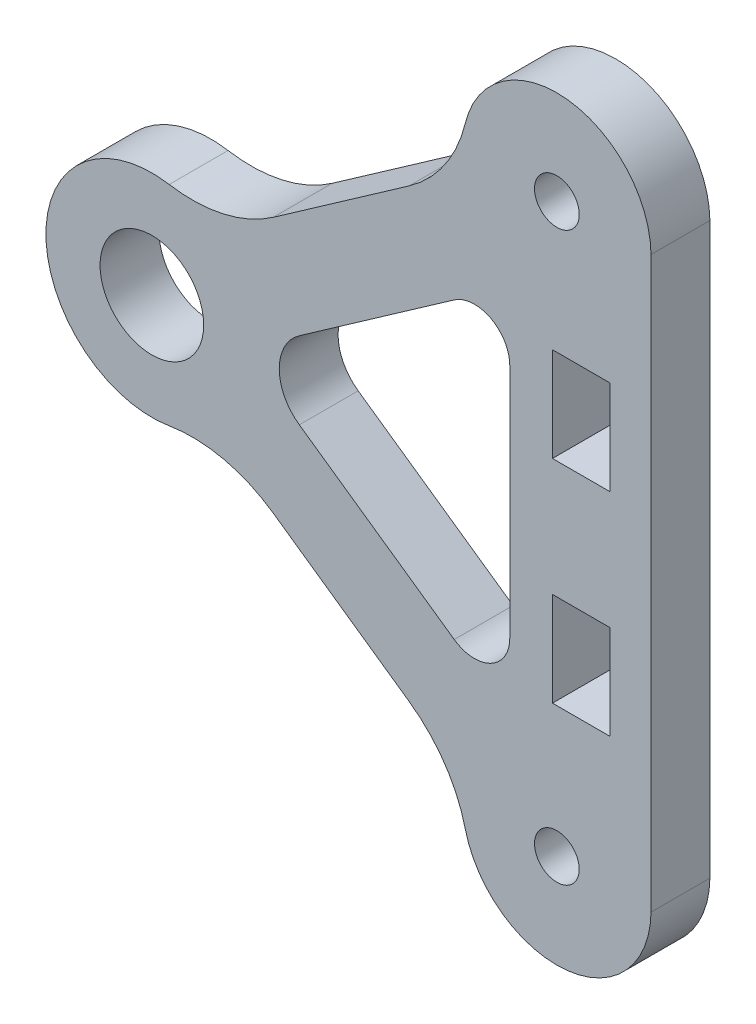
ISO-10303-21;
HEADER;
FILE_DESCRIPTION(('STEP AP214'),'2;1');
FILE_NAME('part.step','',(''),(''),'','','');
FILE_SCHEMA(('AUTOMOTIVE_DESIGN { 1 0 10303 214 1 1 1 1 }'));
ENDSEC;
DATA;
#1=APPLICATION_CONTEXT('core data for automotive mechanical design processes');
#2=APPLICATION_PROTOCOL_DEFINITION('international standard','automotive_design',2000,#1);
#3=PRODUCT_CONTEXT('',#1,'mechanical');
#4=PRODUCT('Part','Part','',(#3));
#5=PRODUCT_RELATED_PRODUCT_CATEGORY('part','',(#4));
#6=PRODUCT_DEFINITION_FORMATION('','',#4);
#7=PRODUCT_DEFINITION_CONTEXT('part definition',#1,'design');
#8=PRODUCT_DEFINITION('design','',#6,#7);
#9=PRODUCT_DEFINITION_SHAPE('','',#8);
#10=(LENGTH_UNIT() NAMED_UNIT(*) SI_UNIT(.MILLI.,.METRE.));
#11=(NAMED_UNIT(*) PLANE_ANGLE_UNIT() SI_UNIT($,.RADIAN.));
#12=(NAMED_UNIT(*) SI_UNIT($,.STERADIAN.) SOLID_ANGLE_UNIT());
#13=UNCERTAINTY_MEASURE_WITH_UNIT(LENGTH_MEASURE(1.E-05),#10,'distance_accuracy_value','');
#14=(GEOMETRIC_REPRESENTATION_CONTEXT(3) GLOBAL_UNCERTAINTY_ASSIGNED_CONTEXT((#13)) GLOBAL_UNIT_ASSIGNED_CONTEXT((#10,
#11,#12)) REPRESENTATION_CONTEXT('',''));
#15=CARTESIAN_POINT('',(0.,0.,0.));
#16=DIRECTION('',(0.,0.,1.));
#17=DIRECTION('',(1.,0.,0.));
#18=AXIS2_PLACEMENT_3D('',#15,#16,#17);
#19=CARTESIAN_POINT('',(-1.73781661886663,28.7897882256831,5.));
#20=DIRECTION('',(0.,0.,1.));
#21=DIRECTION('',(1.,0.,0.));
#22=AXIS2_PLACEMENT_3D('',#19,#20,#21);
#23=PLANE('',#22);
#24=CARTESIAN_POINT('',(17.7021927400794,-24.0902103267437,5.));
#25=DIRECTION('',(0.,0.,1.));
#26=DIRECTION('',(1.,0.,0.));
#27=AXIS2_PLACEMENT_3D('',#24,#25,#26);
#28=CIRCLE('',#27,1.89999999999996);
#29=CARTESIAN_POINT('',(19.6021927400794,-24.0902103267437,5.));
#30=VERTEX_POINT('',#29);
#31=EDGE_CURVE('E267',#30,#30,#28,.T.);
#32=ORIENTED_EDGE('',*,*,#31,.F.);
#33=EDGE_LOOP('',(#32));
#34=FACE_BOUND('',#33,.T.);
#35=DIRECTION('',(0.,1.,0.));
#36=VECTOR('',#35,1.);
#37=CARTESIAN_POINT('',(13.7021925500894,10.0329481065273,5.));
#38=LINE('',#37,#36);
#39=CARTESIAN_POINT('',(13.7021925500894,-10.0329481065273,5.));
#40=VERTEX_POINT('',#39);
#41=CARTESIAN_POINT('',(13.7021925500894,10.0329481065273,5.));
#42=VERTEX_POINT('',#41);
#43=EDGE_CURVE('E281',#40,#42,#38,.T.);
#44=ORIENTED_EDGE('',*,*,#43,.F.);
#45=CARTESIAN_POINT('',(10.7021925500894,-10.0329477062977,5.));
#46=DIRECTION('',(0.,0.,1.));
#47=DIRECTION('',(1.,0.,0.));
#48=AXIS2_PLACEMENT_3D('',#45,#46,#47);
#49=CIRCLE('',#48,3.0000000000001);
#50=CARTESIAN_POINT('',(8.98146324002347,-12.4904038384557,5.));
#51=VERTEX_POINT('',#50);
#52=EDGE_CURVE('E279',#51,#40,#49,.T.);
#53=ORIENTED_EDGE('',*,*,#52,.F.);
#54=DIRECTION('',(0.819152048620843,-0.573576430164522,0.));
#55=VECTOR('',#54,1.);
#56=CARTESIAN_POINT('',(8.98146324002347,-12.4904038384557,5.));
#57=LINE('',#56,#55);
#58=CARTESIAN_POINT('',(-4.17720086729856,-3.27660818584264,5.));
#59=VERTEX_POINT('',#58);
#60=EDGE_CURVE('E291',#59,#51,#57,.T.);
#61=ORIENTED_EDGE('',*,*,#60,.F.);
#62=CARTESIAN_POINT('',(-1.88289513430023,0.,5.));
#63=DIRECTION('',(0.,0.,1.));
#64=DIRECTION('',(1.,0.,0.));
#65=AXIS2_PLACEMENT_3D('',#62,#63,#64);
#66=CIRCLE('',#65,3.99999999999999);
#67=CARTESIAN_POINT('',(-4.17720086729856,3.27660818584263,5.));
#68=VERTEX_POINT('',#67);
#69=EDGE_CURVE('E288',#68,#59,#66,.T.);
#70=ORIENTED_EDGE('',*,*,#69,.F.);
#71=DIRECTION('',(-0.819152048620843,-0.573576430164522,0.));
#72=VECTOR('',#71,1.);
#73=CARTESIAN_POINT('',(-4.17720086729856,3.27660818584263,5.));
#74=LINE('',#73,#72);
#75=CARTESIAN_POINT('',(8.98146324002347,12.4904038384557,5.));
#76=VERTEX_POINT('',#75);
#77=EDGE_CURVE('E286',#76,#68,#74,.T.);
#78=ORIENTED_EDGE('',*,*,#77,.F.);
#79=CARTESIAN_POINT('',(10.7021925500894,10.0329477062979,5.));
#80=DIRECTION('',(0.,0.,1.));
#81=DIRECTION('',(1.,0.,0.));
#82=AXIS2_PLACEMENT_3D('',#79,#80,#81);
#83=CIRCLE('',#82,3.);
#84=EDGE_CURVE('E284',#42,#76,#83,.T.);
#85=ORIENTED_EDGE('',*,*,#84,.F.);
#86=EDGE_LOOP('',(#44,#53,#61,#70,#78,#85));
#87=FACE_BOUND('',#86,.T.);
#88=CARTESIAN_POINT('',(-1.73781661886663,28.7897882256831,5.));
#89=DIRECTION('',(0.,0.,-1.));
#90=DIRECTION('',(1.,0.,0.));
#91=AXIS2_PLACEMENT_3D('',#88,#89,#90);
#92=CIRCLE('',#91,11.9999999815206);
#93=CARTESIAN_POINT('',(9.92618898751999,25.9700414884905,5.));
#94=VERTEX_POINT('',#93);
#95=CARTESIAN_POINT('',(5.14510061734541,18.9599636942148,5.));
#96=VERTEX_POINT('',#95);
#97=EDGE_CURVE('E324',#94,#96,#92,.T.);
#98=ORIENTED_EDGE('',*,*,#97,.T.);
#99=DIRECTION('',(-0.819152033399257,-0.573576451903199,0.));
#100=VECTOR('',#99,1.);
#101=CARTESIAN_POINT('',(-6.38389520204441,10.8872735872865,5.));
#102=LINE('',#101,#100);
#103=CARTESIAN_POINT('',(-6.38389520204441,10.8872735872865,5.));
#104=VERTEX_POINT('',#103);
#105=EDGE_CURVE('E327',#96,#104,#102,.T.);
#106=ORIENTED_EDGE('',*,*,#105,.T.);
#107=CARTESIAN_POINT('',(-13.2668122940058,20.7170982197602,5.));
#108=DIRECTION('',(0.,0.,-1.));
#109=DIRECTION('',(1.,0.,0.));
#110=AXIS2_PLACEMENT_3D('',#107,#108,#109);
#111=CIRCLE('',#110,12.0000000003429);
#112=CARTESIAN_POINT('',(-15.2298870516567,8.87875638046088,5.));
#113=VERTEX_POINT('',#112);
#114=EDGE_CURVE('E330',#104,#113,#111,.T.);
#115=ORIENTED_EDGE('',*,*,#114,.T.);
#116=CARTESIAN_POINT('',(-16.7021931200584,-2.22044604925031E-13,5.));
#117=DIRECTION('',(0.,0.,1.));
#118=DIRECTION('',(1.,0.,0.));
#119=AXIS2_PLACEMENT_3D('',#116,#117,#118);
#120=CIRCLE('',#119,9.0000000009144);
#121=CARTESIAN_POINT('',(-15.2298870517126,-8.87875638012302,5.));
#122=VERTEX_POINT('',#121);
#123=EDGE_CURVE('E332',#113,#122,#120,.T.);
#124=ORIENTED_EDGE('',*,*,#123,.T.);
#125=CARTESIAN_POINT('',(-13.2668122940054,-20.7170982197604,5.));
#126=DIRECTION('',(0.,0.,-1.));
#127=DIRECTION('',(1.,0.,0.));
#128=AXIS2_PLACEMENT_3D('',#125,#126,#127);
#129=CIRCLE('',#128,12.0000000003429);
#130=CARTESIAN_POINT('',(-6.38389520184777,-10.8872735870056,5.));
#131=VERTEX_POINT('',#130);
#132=EDGE_CURVE('E334',#122,#131,#129,.T.);
#133=ORIENTED_EDGE('',*,*,#132,.T.);
#134=DIRECTION('',(0.819152033399257,-0.573576451903199,0.));
#135=VECTOR('',#134,1.);
#136=CARTESIAN_POINT('',(5.14510061734541,-18.9599636942148,5.));
#137=LINE('',#136,#135);
#138=CARTESIAN_POINT('',(5.14510061734541,-18.9599636942148,5.));
#139=VERTEX_POINT('',#138);
#140=EDGE_CURVE('E336',#131,#139,#137,.T.);
#141=ORIENTED_EDGE('',*,*,#140,.T.);
#142=CARTESIAN_POINT('',(-1.73781673118567,-28.7897881470367,5.));
#143=DIRECTION('',(0.,0.,-1.));
#144=DIRECTION('',(1.,0.,0.));
#145=AXIS2_PLACEMENT_3D('',#142,#143,#144);
#146=CIRCLE('',#145,11.9999999996595);
#147=CARTESIAN_POINT('',(9.92618895223582,-25.9700414547008,5.));
#148=VERTEX_POINT('',#147);
#149=EDGE_CURVE('E338',#139,#148,#146,.T.);
#150=ORIENTED_EDGE('',*,*,#149,.T.);
#151=CARTESIAN_POINT('',(17.7021927400794,-24.0902103267437,5.));
#152=DIRECTION('',(0.,0.,1.));
#153=DIRECTION('',(1.,0.,0.));
#154=AXIS2_PLACEMENT_3D('',#151,#152,#153);
#155=CIRCLE('',#154,7.99999999948895);
#156=CARTESIAN_POINT('',(25.7015677395685,-24.1902083735915,5.));
#157=VERTEX_POINT('',#156);
#158=EDGE_CURVE('E340',#148,#157,#155,.T.);
#159=ORIENTED_EDGE('',*,*,#158,.T.);
#160=DIRECTION('',(0.,1.,0.));
#161=VECTOR('',#160,1.);
#162=CARTESIAN_POINT('',(25.7015677400795,24.1902083735992,5.));
#163=LINE('',#162,#161);
#164=CARTESIAN_POINT('',(25.7015677400795,24.1902083735992,5.));
#165=VERTEX_POINT('',#164);
#166=EDGE_CURVE('E342',#157,#165,#163,.T.);
#167=ORIENTED_EDGE('',*,*,#166,.T.);
#168=CARTESIAN_POINT('',(17.7021927400794,24.0902103267435,5.));
#169=DIRECTION('',(0.,0.,1.));
#170=DIRECTION('',(1.,0.,0.));
#171=AXIS2_PLACEMENT_3D('',#168,#169,#170);
#172=CIRCLE('',#171,7.99999997228086);
#173=EDGE_CURVE('E344',#165,#94,#172,.T.);
#174=ORIENTED_EDGE('',*,*,#173,.T.);
#175=EDGE_LOOP('',(#98,#106,#115,#124,#133,#141,#150,#159,#167,#174));
#176=FACE_BOUND('',#175,.T.);
#177=CARTESIAN_POINT('',(17.7021927400794,24.0902103267435,5.));
#178=DIRECTION('',(0.,0.,1.));
#179=DIRECTION('',(1.,0.,0.));
#180=AXIS2_PLACEMENT_3D('',#177,#178,#179);
#181=CIRCLE('',#180,1.89999999999996);
#182=CARTESIAN_POINT('',(19.6021927400794,24.0902103267435,5.));
#183=VERTEX_POINT('',#182);
#184=EDGE_CURVE('E273',#183,#183,#181,.T.);
#185=ORIENTED_EDGE('',*,*,#184,.F.);
#186=EDGE_LOOP('',(#185));
#187=FACE_BOUND('',#186,.T.);
#188=CARTESIAN_POINT('',(-16.7021931200584,-2.22044604925031E-13,5.));
#189=DIRECTION('',(0.,0.,1.));
#190=DIRECTION('',(1.,0.,0.));
#191=AXIS2_PLACEMENT_3D('',#188,#189,#190);
#192=CIRCLE('',#191,4.40000000000001);
#193=CARTESIAN_POINT('',(-12.3021931200584,-2.22044604925031E-13,5.));
#194=VERTEX_POINT('',#193);
#195=EDGE_CURVE('E261',#194,#194,#192,.T.);
#196=ORIENTED_EDGE('',*,*,#195,.F.);
#197=EDGE_LOOP('',(#196));
#198=FACE_BOUND('',#197,.T.);
#199=DIRECTION('',(-1.,0.,0.));
#200=VECTOR('',#199,1.);
#201=CARTESIAN_POINT('',(17.3271927258297,13.0000002682211,5.));
#202=LINE('',#201,#200);
#203=CARTESIAN_POINT('',(22.2271925463635,13.0000002682211,5.));
#204=VERTEX_POINT('',#203);
#205=CARTESIAN_POINT('',(17.3271927258297,13.0000002682211,5.));
#206=VERTEX_POINT('',#205);
#207=EDGE_CURVE('E232',#204,#206,#202,.T.);
#208=ORIENTED_EDGE('',*,*,#207,.F.);
#209=DIRECTION('',(0.,1.,0.));
#210=VECTOR('',#209,1.);
#211=CARTESIAN_POINT('',(22.2271925463635,13.0000002682211,5.));
#212=LINE('',#211,#210);
#213=CARTESIAN_POINT('',(22.2271925463635,4.99999988824151,5.));
#214=VERTEX_POINT('',#213);
#215=EDGE_CURVE('E230',#214,#204,#212,.T.);
#216=ORIENTED_EDGE('',*,*,#215,.F.);
#217=DIRECTION('',(1.,0.,0.));
#218=VECTOR('',#217,1.);
#219=CARTESIAN_POINT('',(22.2271925463635,4.99999988824151,5.));
#220=LINE('',#219,#218);
#221=CARTESIAN_POINT('',(17.3271927258295,4.99999988824151,5.));
#222=VERTEX_POINT('',#221);
#223=EDGE_CURVE('E238',#222,#214,#220,.T.);
#224=ORIENTED_EDGE('',*,*,#223,.F.);
#225=DIRECTION('',(0.,-1.,0.));
#226=VECTOR('',#225,1.);
#227=CARTESIAN_POINT('',(17.3271927258295,4.99999988824151,5.));
#228=LINE('',#227,#226);
#229=EDGE_CURVE('E235',#206,#222,#228,.T.);
#230=ORIENTED_EDGE('',*,*,#229,.F.);
#231=EDGE_LOOP('',(#208,#216,#224,#230));
#232=FACE_BOUND('',#231,.T.);
#233=DIRECTION('',(-1.,0.,0.));
#234=VECTOR('',#233,1.);
#235=CARTESIAN_POINT('',(17.3271927258295,-4.99999988824107,5.));
#236=LINE('',#235,#234);
#237=CARTESIAN_POINT('',(22.2271925463637,-4.99999988824129,5.));
#238=VERTEX_POINT('',#237);
#239=CARTESIAN_POINT('',(17.3271927258295,-4.99999988824107,5.));
#240=VERTEX_POINT('',#239);
#241=EDGE_CURVE('E202',#238,#240,#236,.T.);
#242=ORIENTED_EDGE('',*,*,#241,.F.);
#243=DIRECTION('',(0.,1.,0.));
#244=VECTOR('',#243,1.);
#245=CARTESIAN_POINT('',(22.2271925463637,-4.99999988824129,5.));
#246=LINE('',#245,#244);
#247=CARTESIAN_POINT('',(22.2271925463637,-13.0000002682207,5.));
#248=VERTEX_POINT('',#247);
#249=EDGE_CURVE('E194',#248,#238,#246,.T.);
#250=ORIENTED_EDGE('',*,*,#249,.F.);
#251=DIRECTION('',(1.,0.,0.));
#252=VECTOR('',#251,1.);
#253=CARTESIAN_POINT('',(22.2271925463637,-13.0000002682207,5.));
#254=LINE('',#253,#252);
#255=CARTESIAN_POINT('',(17.3271927258295,-13.0000002682209,5.));
#256=VERTEX_POINT('',#255);
#257=EDGE_CURVE('E216',#256,#248,#254,.T.);
#258=ORIENTED_EDGE('',*,*,#257,.F.);
#259=DIRECTION('',(0.,-1.,0.));
#260=VECTOR('',#259,1.);
#261=CARTESIAN_POINT('',(17.3271927258295,-13.0000002682209,5.));
#262=LINE('',#261,#260);
#263=EDGE_CURVE('E214',#240,#256,#262,.T.);
#264=ORIENTED_EDGE('',*,*,#263,.F.);
#265=EDGE_LOOP('',(#242,#250,#258,#264));
#266=FACE_BOUND('',#265,.T.);
#267=ADVANCED_FACE('F33',(#34,#87,#176,#187,#198,#232,#266),#23,.T.);
#268=CARTESIAN_POINT('',(-1.73781661886663,28.7897882256831,0.));
#269=DIRECTION('',(0.,0.,1.));
#270=DIRECTION('',(1.,0.,0.));
#271=AXIS2_PLACEMENT_3D('',#268,#269,#270);
#272=PLANE('',#271);
#273=DIRECTION('',(0.,1.,0.));
#274=VECTOR('',#273,1.);
#275=CARTESIAN_POINT('',(22.2271925463635,13.0000002682211,0.));
#276=LINE('',#275,#274);
#277=CARTESIAN_POINT('',(22.2271925463635,4.99999988824151,0.));
#278=VERTEX_POINT('',#277);
#279=CARTESIAN_POINT('',(22.2271925463635,13.0000002682211,0.));
#280=VERTEX_POINT('',#279);
#281=EDGE_CURVE('E210',#278,#280,#276,.T.);
#282=ORIENTED_EDGE('',*,*,#281,.T.);
#283=DIRECTION('',(-1.,0.,0.));
#284=VECTOR('',#283,1.);
#285=CARTESIAN_POINT('',(17.3271927258297,13.0000002682211,0.));
#286=LINE('',#285,#284);
#287=CARTESIAN_POINT('',(17.3271927258297,13.0000002682211,0.));
#288=VERTEX_POINT('',#287);
#289=EDGE_CURVE('E243',#280,#288,#286,.T.);
#290=ORIENTED_EDGE('',*,*,#289,.T.);
#291=DIRECTION('',(0.,-1.,0.));
#292=VECTOR('',#291,1.);
#293=CARTESIAN_POINT('',(17.3271927258295,4.99999988824151,0.));
#294=LINE('',#293,#292);
#295=CARTESIAN_POINT('',(17.3271927258295,4.99999988824151,0.));
#296=VERTEX_POINT('',#295);
#297=EDGE_CURVE('E246',#288,#296,#294,.T.);
#298=ORIENTED_EDGE('',*,*,#297,.T.);
#299=DIRECTION('',(1.,0.,0.));
#300=VECTOR('',#299,1.);
#301=CARTESIAN_POINT('',(22.2271925463635,4.99999988824151,0.));
#302=LINE('',#301,#300);
#303=EDGE_CURVE('E233',#296,#278,#302,.T.);
#304=ORIENTED_EDGE('',*,*,#303,.T.);
#305=EDGE_LOOP('',(#282,#290,#298,#304));
#306=FACE_BOUND('',#305,.T.);
#307=CARTESIAN_POINT('',(-1.73781661886663,28.7897882256831,0.));
#308=DIRECTION('',(0.,0.,-1.));
#309=DIRECTION('',(1.,0.,0.));
#310=AXIS2_PLACEMENT_3D('',#307,#308,#309);
#311=CIRCLE('',#310,11.9999999815206);
#312=CARTESIAN_POINT('',(9.92618898751999,25.9700414884905,0.));
#313=VERTEX_POINT('',#312);
#314=CARTESIAN_POINT('',(5.14510061734541,18.9599636942148,0.));
#315=VERTEX_POINT('',#314);
#316=EDGE_CURVE('E323',#313,#315,#311,.T.);
#317=ORIENTED_EDGE('',*,*,#316,.F.);
#318=CARTESIAN_POINT('',(17.7021927400794,24.0902103267435,0.));
#319=DIRECTION('',(0.,0.,1.));
#320=DIRECTION('',(1.,0.,0.));
#321=AXIS2_PLACEMENT_3D('',#318,#319,#320);
#322=CIRCLE('',#321,7.99999997228086);
#323=CARTESIAN_POINT('',(25.7015677400795,24.1902083735992,0.));
#324=VERTEX_POINT('',#323);
#325=EDGE_CURVE('E328',#324,#313,#322,.T.);
#326=ORIENTED_EDGE('',*,*,#325,.F.);
#327=DIRECTION('',(0.,1.,0.));
#328=VECTOR('',#327,1.);
#329=CARTESIAN_POINT('',(25.7015677400795,24.1902083735992,0.));
#330=LINE('',#329,#328);
#331=CARTESIAN_POINT('',(25.7015677395685,-24.1902083735915,0.));
#332=VERTEX_POINT('',#331);
#333=EDGE_CURVE('E363',#332,#324,#330,.T.);
#334=ORIENTED_EDGE('',*,*,#333,.F.);
#335=CARTESIAN_POINT('',(17.7021927400794,-24.0902103267437,0.));
#336=DIRECTION('',(0.,0.,1.));
#337=DIRECTION('',(1.,0.,0.));
#338=AXIS2_PLACEMENT_3D('',#335,#336,#337);
#339=CIRCLE('',#338,7.99999999948895);
#340=CARTESIAN_POINT('',(9.92618895223582,-25.9700414547008,0.));
#341=VERTEX_POINT('',#340);
#342=EDGE_CURVE('E361',#341,#332,#339,.T.);
#343=ORIENTED_EDGE('',*,*,#342,.F.);
#344=CARTESIAN_POINT('',(-1.73781673118567,-28.7897881470367,0.));
#345=DIRECTION('',(0.,0.,-1.));
#346=DIRECTION('',(1.,0.,0.));
#347=AXIS2_PLACEMENT_3D('',#344,#345,#346);
#348=CIRCLE('',#347,11.9999999996595);
#349=CARTESIAN_POINT('',(5.14510061734541,-18.9599636942148,0.));
#350=VERTEX_POINT('',#349);
#351=EDGE_CURVE('E359',#350,#341,#348,.T.);
#352=ORIENTED_EDGE('',*,*,#351,.F.);
#353=DIRECTION('',(0.819152033399257,-0.573576451903199,0.));
#354=VECTOR('',#353,1.);
#355=CARTESIAN_POINT('',(5.14510061734541,-18.9599636942148,0.));
#356=LINE('',#355,#354);
#357=CARTESIAN_POINT('',(-6.38389520184777,-10.8872735870056,0.));
#358=VERTEX_POINT('',#357);
#359=EDGE_CURVE('E357',#358,#350,#356,.T.);
#360=ORIENTED_EDGE('',*,*,#359,.F.);
#361=CARTESIAN_POINT('',(-13.2668122940054,-20.7170982197604,0.));
#362=DIRECTION('',(0.,0.,-1.));
#363=DIRECTION('',(1.,0.,0.));
#364=AXIS2_PLACEMENT_3D('',#361,#362,#363);
#365=CIRCLE('',#364,12.0000000003429);
#366=CARTESIAN_POINT('',(-15.2298870517126,-8.87875638012302,0.));
#367=VERTEX_POINT('',#366);
#368=EDGE_CURVE('E355',#367,#358,#365,.T.);
#369=ORIENTED_EDGE('',*,*,#368,.F.);
#370=CARTESIAN_POINT('',(-16.7021931200584,-2.22044604925031E-13,0.));
#371=DIRECTION('',(0.,0.,1.));
#372=DIRECTION('',(1.,0.,0.));
#373=AXIS2_PLACEMENT_3D('',#370,#371,#372);
#374=CIRCLE('',#373,9.0000000009144);
#375=CARTESIAN_POINT('',(-15.2298870516567,8.87875638046088,0.));
#376=VERTEX_POINT('',#375);
#377=EDGE_CURVE('E353',#376,#367,#374,.T.);
#378=ORIENTED_EDGE('',*,*,#377,.F.);
#379=CARTESIAN_POINT('',(-13.2668122940058,20.7170982197602,0.));
#380=DIRECTION('',(0.,0.,-1.));
#381=DIRECTION('',(1.,0.,0.));
#382=AXIS2_PLACEMENT_3D('',#379,#380,#381);
#383=CIRCLE('',#382,12.0000000003429);
#384=CARTESIAN_POINT('',(-6.38389520204441,10.8872735872865,0.));
#385=VERTEX_POINT('',#384);
#386=EDGE_CURVE('E351',#385,#376,#383,.T.);
#387=ORIENTED_EDGE('',*,*,#386,.F.);
#388=DIRECTION('',(-0.819152033399257,-0.573576451903199,0.));
#389=VECTOR('',#388,1.);
#390=CARTESIAN_POINT('',(-6.38389520204441,10.8872735872865,0.));
#391=LINE('',#390,#389);
#392=EDGE_CURVE('E349',#315,#385,#391,.T.);
#393=ORIENTED_EDGE('',*,*,#392,.F.);
#394=EDGE_LOOP('',(#317,#326,#334,#343,#352,#360,#369,#378,#387,#393));
#395=FACE_BOUND('',#394,.T.);
#396=CARTESIAN_POINT('',(10.7021925500894,-10.0329477062977,0.));
#397=DIRECTION('',(0.,0.,1.));
#398=DIRECTION('',(1.,0.,0.));
#399=AXIS2_PLACEMENT_3D('',#396,#397,#398);
#400=CIRCLE('',#399,3.0000000000001);
#401=CARTESIAN_POINT('',(8.98146324002347,-12.4904038384557,0.));
#402=VERTEX_POINT('',#401);
#403=CARTESIAN_POINT('',(13.7021925500894,-10.0329481065273,0.));
#404=VERTEX_POINT('',#403);
#405=EDGE_CURVE('E276',#402,#404,#400,.T.);
#406=ORIENTED_EDGE('',*,*,#405,.T.);
#407=DIRECTION('',(0.,1.,0.));
#408=VECTOR('',#407,1.);
#409=CARTESIAN_POINT('',(13.7021925500894,10.0329481065273,0.));
#410=LINE('',#409,#408);
#411=CARTESIAN_POINT('',(13.7021925500894,10.0329481065273,0.));
#412=VERTEX_POINT('',#411);
#413=EDGE_CURVE('E296',#404,#412,#410,.T.);
#414=ORIENTED_EDGE('',*,*,#413,.T.);
#415=CARTESIAN_POINT('',(10.7021925500894,10.0329477062979,0.));
#416=DIRECTION('',(0.,0.,1.));
#417=DIRECTION('',(1.,0.,0.));
#418=AXIS2_PLACEMENT_3D('',#415,#416,#417);
#419=CIRCLE('',#418,3.);
#420=CARTESIAN_POINT('',(8.98146324002347,12.4904038384557,0.));
#421=VERTEX_POINT('',#420);
#422=EDGE_CURVE('E299',#412,#421,#419,.T.);
#423=ORIENTED_EDGE('',*,*,#422,.T.);
#424=DIRECTION('',(-0.819152048620843,-0.573576430164522,0.));
#425=VECTOR('',#424,1.);
#426=CARTESIAN_POINT('',(-4.17720086729856,3.27660818584263,0.));
#427=LINE('',#426,#425);
#428=CARTESIAN_POINT('',(-4.17720086729856,3.27660818584263,0.));
#429=VERTEX_POINT('',#428);
#430=EDGE_CURVE('E302',#421,#429,#427,.T.);
#431=ORIENTED_EDGE('',*,*,#430,.T.);
#432=CARTESIAN_POINT('',(-1.88289513430023,0.,0.));
#433=DIRECTION('',(0.,0.,1.));
#434=DIRECTION('',(1.,0.,0.));
#435=AXIS2_PLACEMENT_3D('',#432,#433,#434);
#436=CIRCLE('',#435,3.99999999999999);
#437=CARTESIAN_POINT('',(-4.17720086729856,-3.27660818584263,0.));
#438=VERTEX_POINT('',#437);
#439=EDGE_CURVE('E305',#429,#438,#436,.T.);
#440=ORIENTED_EDGE('',*,*,#439,.T.);
#441=DIRECTION('',(0.819152048620843,-0.573576430164522,0.));
#442=VECTOR('',#441,1.);
#443=CARTESIAN_POINT('',(8.98146324002347,-12.4904038384557,0.));
#444=LINE('',#443,#442);
#445=EDGE_CURVE('E282',#438,#402,#444,.T.);
#446=ORIENTED_EDGE('',*,*,#445,.T.);
#447=EDGE_LOOP('',(#406,#414,#423,#431,#440,#446));
#448=FACE_BOUND('',#447,.T.);
#449=CARTESIAN_POINT('',(17.7021927400794,24.0902103267435,0.));
#450=DIRECTION('',(0.,0.,1.));
#451=DIRECTION('',(1.,0.,0.));
#452=AXIS2_PLACEMENT_3D('',#449,#450,#451);
#453=CIRCLE('',#452,1.89999999999996);
#454=CARTESIAN_POINT('',(19.6021927400794,24.0902103267435,0.));
#455=VERTEX_POINT('',#454);
#456=EDGE_CURVE('E270',#455,#455,#453,.T.);
#457=ORIENTED_EDGE('',*,*,#456,.T.);
#458=EDGE_LOOP('',(#457));
#459=FACE_BOUND('',#458,.T.);
#460=CARTESIAN_POINT('',(17.7021927400794,-24.0902103267437,0.));
#461=DIRECTION('',(0.,0.,1.));
#462=DIRECTION('',(1.,0.,0.));
#463=AXIS2_PLACEMENT_3D('',#460,#461,#462);
#464=CIRCLE('',#463,1.89999999999996);
#465=CARTESIAN_POINT('',(19.6021927400794,-24.0902103267437,0.));
#466=VERTEX_POINT('',#465);
#467=EDGE_CURVE('E264',#466,#466,#464,.T.);
#468=ORIENTED_EDGE('',*,*,#467,.T.);
#469=EDGE_LOOP('',(#468));
#470=FACE_BOUND('',#469,.T.);
#471=CARTESIAN_POINT('',(-16.7021931200584,-2.22044604925031E-13,0.));
#472=DIRECTION('',(0.,0.,1.));
#473=DIRECTION('',(1.,0.,0.));
#474=AXIS2_PLACEMENT_3D('',#471,#472,#473);
#475=CIRCLE('',#474,4.40000000000001);
#476=CARTESIAN_POINT('',(-12.3021931200584,-2.22044604925031E-13,0.));
#477=VERTEX_POINT('',#476);
#478=EDGE_CURVE('E260',#477,#477,#475,.T.);
#479=ORIENTED_EDGE('',*,*,#478,.T.);
#480=EDGE_LOOP('',(#479));
#481=FACE_BOUND('',#480,.T.);
#482=DIRECTION('',(0.,1.,0.));
#483=VECTOR('',#482,1.);
#484=CARTESIAN_POINT('',(22.2271925463637,-4.99999988824129,0.));
#485=LINE('',#484,#483);
#486=CARTESIAN_POINT('',(22.2271925463637,-13.0000002682207,0.));
#487=VERTEX_POINT('',#486);
#488=CARTESIAN_POINT('',(22.2271925463637,-4.99999988824129,0.));
#489=VERTEX_POINT('',#488);
#490=EDGE_CURVE('E56',#487,#489,#485,.T.);
#491=ORIENTED_EDGE('',*,*,#490,.T.);
#492=DIRECTION('',(-1.,0.,0.));
#493=VECTOR('',#492,1.);
#494=CARTESIAN_POINT('',(17.3271927258295,-4.99999988824107,0.));
#495=LINE('',#494,#493);
#496=CARTESIAN_POINT('',(17.3271927258295,-4.99999988824107,0.));
#497=VERTEX_POINT('',#496);
#498=EDGE_CURVE('E209',#489,#497,#495,.T.);
#499=ORIENTED_EDGE('',*,*,#498,.T.);
#500=DIRECTION('',(0.,-1.,0.));
#501=VECTOR('',#500,1.);
#502=CARTESIAN_POINT('',(17.3271927258295,-13.0000002682209,0.));
#503=LINE('',#502,#501);
#504=CARTESIAN_POINT('',(17.3271927258295,-13.0000002682209,0.));
#505=VERTEX_POINT('',#504);
#506=EDGE_CURVE('E222',#497,#505,#503,.T.);
#507=ORIENTED_EDGE('',*,*,#506,.T.);
#508=DIRECTION('',(1.,0.,0.));
#509=VECTOR('',#508,1.);
#510=CARTESIAN_POINT('',(22.2271925463637,-13.0000002682207,0.));
#511=LINE('',#510,#509);
#512=EDGE_CURVE('E203',#505,#487,#511,.T.);
#513=ORIENTED_EDGE('',*,*,#512,.T.);
#514=EDGE_LOOP('',(#491,#499,#507,#513));
#515=FACE_BOUND('',#514,.T.);
#516=ADVANCED_FACE('F399',(#306,#395,#448,#459,#470,#481,#515),#272,.F.);
#517=CARTESIAN_POINT('',(-1.73781661886663,28.7897882256831,5.));
#518=DIRECTION('',(0.,0.,-1.));
#519=DIRECTION('',(-1.,0.,0.));
#520=AXIS2_PLACEMENT_3D('',#517,#518,#519);
#521=CYLINDRICAL_SURFACE('',#520,11.9999999815206);
#522=ORIENTED_EDGE('',*,*,#316,.T.);
#523=DIRECTION('',(0.,0.,-1.));
#524=VECTOR('',#523,1.);
#525=CARTESIAN_POINT('',(5.14510061734541,18.9599636942148,5.));
#526=LINE('',#525,#524);
#527=EDGE_CURVE('E11',#96,#315,#526,.T.);
#528=ORIENTED_EDGE('',*,*,#527,.F.);
#529=ORIENTED_EDGE('',*,*,#97,.F.);
#530=DIRECTION('',(0.,0.,-1.));
#531=VECTOR('',#530,1.);
#532=CARTESIAN_POINT('',(9.92618898751999,25.9700414884905,5.));
#533=LINE('',#532,#531);
#534=EDGE_CURVE('E346',#94,#313,#533,.T.);
#535=ORIENTED_EDGE('',*,*,#534,.T.);
#536=EDGE_LOOP('',(#522,#528,#529,#535));
#537=FACE_BOUND('',#536,.T.);
#538=ADVANCED_FACE('F35',(#537),#521,.F.);
#539=CARTESIAN_POINT('',(-6.38389520204441,10.8872735872865,5.));
#540=DIRECTION('',(0.573576451903199,-0.819152033399257,0.));
#541=DIRECTION('',(0.819152033399257,0.573576451903199,0.));
#542=AXIS2_PLACEMENT_3D('',#539,#540,#541);
#543=PLANE('',#542);
#544=ORIENTED_EDGE('',*,*,#392,.T.);
#545=DIRECTION('',(0.,0.,-1.));
#546=VECTOR('',#545,1.);
#547=CARTESIAN_POINT('',(-6.38389520204441,10.8872735872865,5.));
#548=LINE('',#547,#546);
#549=EDGE_CURVE('E41',#104,#385,#548,.T.);
#550=ORIENTED_EDGE('',*,*,#549,.F.);
#551=ORIENTED_EDGE('',*,*,#105,.F.);
#552=ORIENTED_EDGE('',*,*,#527,.T.);
#553=EDGE_LOOP('',(#544,#550,#551,#552));
#554=FACE_BOUND('',#553,.T.);
#555=ADVANCED_FACE('F417',(#554),#543,.F.);
#556=CARTESIAN_POINT('',(-13.2668122940058,20.7170982197602,5.));
#557=DIRECTION('',(0.,0.,-1.));
#558=DIRECTION('',(-1.,0.,0.));
#559=AXIS2_PLACEMENT_3D('',#556,#557,#558);
#560=CYLINDRICAL_SURFACE('',#559,12.0000000003429);
#561=ORIENTED_EDGE('',*,*,#386,.T.);
#562=DIRECTION('',(0.,0.,-1.));
#563=VECTOR('',#562,1.);
#564=CARTESIAN_POINT('',(-15.2298870516567,8.87875638046088,5.));
#565=LINE('',#564,#563);
#566=EDGE_CURVE('E386',#113,#376,#565,.T.);
#567=ORIENTED_EDGE('',*,*,#566,.F.);
#568=ORIENTED_EDGE('',*,*,#114,.F.);
#569=ORIENTED_EDGE('',*,*,#549,.T.);
#570=EDGE_LOOP('',(#561,#567,#568,#569));
#571=FACE_BOUND('',#570,.T.);
#572=ADVANCED_FACE('F393',(#571),#560,.F.);
#573=CARTESIAN_POINT('',(-16.7021931200584,-2.22044604925031E-13,5.));
#574=DIRECTION('',(0.,0.,-1.));
#575=DIRECTION('',(-1.,0.,0.));
#576=AXIS2_PLACEMENT_3D('',#573,#574,#575);
#577=CYLINDRICAL_SURFACE('',#576,9.0000000009144);
#578=ORIENTED_EDGE('',*,*,#377,.T.);
#579=DIRECTION('',(0.,0.,-1.));
#580=VECTOR('',#579,1.);
#581=CARTESIAN_POINT('',(-15.2298870517126,-8.87875638012302,5.));
#582=LINE('',#581,#580);
#583=EDGE_CURVE('E383',#122,#367,#582,.T.);
#584=ORIENTED_EDGE('',*,*,#583,.F.);
#585=ORIENTED_EDGE('',*,*,#123,.F.);
#586=ORIENTED_EDGE('',*,*,#566,.T.);
#587=EDGE_LOOP('',(#578,#584,#585,#586));
#588=FACE_BOUND('',#587,.T.);
#589=ADVANCED_FACE('F405',(#588),#577,.T.);
#590=CARTESIAN_POINT('',(-13.2668122940054,-20.7170982197604,5.));
#591=DIRECTION('',(0.,0.,-1.));
#592=DIRECTION('',(-1.,0.,0.));
#593=AXIS2_PLACEMENT_3D('',#590,#591,#592);
#594=CYLINDRICAL_SURFACE('',#593,12.0000000003429);
#595=ORIENTED_EDGE('',*,*,#368,.T.);
#596=DIRECTION('',(0.,0.,-1.));
#597=VECTOR('',#596,1.);
#598=CARTESIAN_POINT('',(-6.38389520184777,-10.8872735870056,5.));
#599=LINE('',#598,#597);
#600=EDGE_CURVE('E380',#131,#358,#599,.T.);
#601=ORIENTED_EDGE('',*,*,#600,.F.);
#602=ORIENTED_EDGE('',*,*,#132,.F.);
#603=ORIENTED_EDGE('',*,*,#583,.T.);
#604=EDGE_LOOP('',(#595,#601,#602,#603));
#605=FACE_BOUND('',#604,.T.);
#606=ADVANCED_FACE('F409',(#605),#594,.F.);
#607=CARTESIAN_POINT('',(5.14510061734541,-18.9599636942148,5.));
#608=DIRECTION('',(0.573576451903199,0.819152033399257,0.));
#609=DIRECTION('',(-0.819152033399257,0.573576451903199,0.));
#610=AXIS2_PLACEMENT_3D('',#607,#608,#609);
#611=PLANE('',#610);
#612=ORIENTED_EDGE('',*,*,#359,.T.);
#613=DIRECTION('',(0.,0.,-1.));
#614=VECTOR('',#613,1.);
#615=CARTESIAN_POINT('',(5.14510061734541,-18.9599636942148,5.));
#616=LINE('',#615,#614);
#617=EDGE_CURVE('E377',#139,#350,#616,.T.);
#618=ORIENTED_EDGE('',*,*,#617,.F.);
#619=ORIENTED_EDGE('',*,*,#140,.F.);
#620=ORIENTED_EDGE('',*,*,#600,.T.);
#621=EDGE_LOOP('',(#612,#618,#619,#620));
#622=FACE_BOUND('',#621,.T.);
#623=ADVANCED_FACE('F440',(#622),#611,.F.);
#624=CARTESIAN_POINT('',(-1.73781673118567,-28.7897881470367,5.));
#625=DIRECTION('',(0.,0.,-1.));
#626=DIRECTION('',(-1.,0.,0.));
#627=AXIS2_PLACEMENT_3D('',#624,#625,#626);
#628=CYLINDRICAL_SURFACE('',#627,11.9999999996595);
#629=ORIENTED_EDGE('',*,*,#351,.T.);
#630=DIRECTION('',(0.,0.,-1.));
#631=VECTOR('',#630,1.);
#632=CARTESIAN_POINT('',(9.92618895223582,-25.9700414547008,5.));
#633=LINE('',#632,#631);
#634=EDGE_CURVE('E374',#148,#341,#633,.T.);
#635=ORIENTED_EDGE('',*,*,#634,.F.);
#636=ORIENTED_EDGE('',*,*,#149,.F.);
#637=ORIENTED_EDGE('',*,*,#617,.T.);
#638=EDGE_LOOP('',(#629,#635,#636,#637));
#639=FACE_BOUND('',#638,.T.);
#640=ADVANCED_FACE('F437',(#639),#628,.F.);
#641=CARTESIAN_POINT('',(17.7021927400794,-24.0902103267437,5.));
#642=DIRECTION('',(0.,0.,-1.));
#643=DIRECTION('',(-1.,0.,0.));
#644=AXIS2_PLACEMENT_3D('',#641,#642,#643);
#645=CYLINDRICAL_SURFACE('',#644,7.99999999948895);
#646=ORIENTED_EDGE('',*,*,#342,.T.);
#647=DIRECTION('',(0.,0.,-1.));
#648=VECTOR('',#647,1.);
#649=CARTESIAN_POINT('',(25.7015677395685,-24.1902083735915,5.));
#650=LINE('',#649,#648);
#651=EDGE_CURVE('E371',#157,#332,#650,.T.);
#652=ORIENTED_EDGE('',*,*,#651,.F.);
#653=ORIENTED_EDGE('',*,*,#158,.F.);
#654=ORIENTED_EDGE('',*,*,#634,.T.);
#655=EDGE_LOOP('',(#646,#652,#653,#654));
#656=FACE_BOUND('',#655,.T.);
#657=ADVANCED_FACE('F433',(#656),#645,.T.);
#658=CARTESIAN_POINT('',(25.7015677400795,24.1902083735992,5.));
#659=DIRECTION('',(-1.,0.,0.));
#660=DIRECTION('',(0.,-1.,0.));
#661=AXIS2_PLACEMENT_3D('',#658,#659,#660);
#662=PLANE('',#661);
#663=ORIENTED_EDGE('',*,*,#333,.T.);
#664=DIRECTION('',(0.,0.,-1.));
#665=VECTOR('',#664,1.);
#666=CARTESIAN_POINT('',(25.7015677400795,24.1902083735992,5.));
#667=LINE('',#666,#665);
#668=EDGE_CURVE('E368',#165,#324,#667,.T.);
#669=ORIENTED_EDGE('',*,*,#668,.F.);
#670=ORIENTED_EDGE('',*,*,#166,.F.);
#671=ORIENTED_EDGE('',*,*,#651,.T.);
#672=EDGE_LOOP('',(#663,#669,#670,#671));
#673=FACE_BOUND('',#672,.T.);
#674=ADVANCED_FACE('F429',(#673),#662,.F.);
#675=CARTESIAN_POINT('',(17.7021927400794,24.0902103267435,5.));
#676=DIRECTION('',(0.,0.,-1.));
#677=DIRECTION('',(-1.,0.,0.));
#678=AXIS2_PLACEMENT_3D('',#675,#676,#677);
#679=CYLINDRICAL_SURFACE('',#678,7.99999997228086);
#680=ORIENTED_EDGE('',*,*,#325,.T.);
#681=ORIENTED_EDGE('',*,*,#534,.F.);
#682=ORIENTED_EDGE('',*,*,#173,.F.);
#683=ORIENTED_EDGE('',*,*,#668,.T.);
#684=EDGE_LOOP('',(#680,#681,#682,#683));
#685=FACE_BOUND('',#684,.T.);
#686=ADVANCED_FACE('F424',(#685),#679,.T.);
#687=CARTESIAN_POINT('',(10.7021925500894,-10.0329477062977,5.));
#688=DIRECTION('',(0.,0.,-1.));
#689=DIRECTION('',(-1.,0.,0.));
#690=AXIS2_PLACEMENT_3D('',#687,#688,#689);
#691=CYLINDRICAL_SURFACE('',#690,3.0000000000001);
#692=ORIENTED_EDGE('',*,*,#405,.F.);
#693=DIRECTION('',(0.,0.,-1.));
#694=VECTOR('',#693,1.);
#695=CARTESIAN_POINT('',(8.98146324002347,-12.4904038384557,5.));
#696=LINE('',#695,#694);
#697=EDGE_CURVE('E293',#51,#402,#696,.T.);
#698=ORIENTED_EDGE('',*,*,#697,.F.);
#699=ORIENTED_EDGE('',*,*,#52,.T.);
#700=DIRECTION('',(0.,0.,-1.));
#701=VECTOR('',#700,1.);
#702=CARTESIAN_POINT('',(13.7021925500894,-10.0329481065273,5.));
#703=LINE('',#702,#701);
#704=EDGE_CURVE('E320',#40,#404,#703,.T.);
#705=ORIENTED_EDGE('',*,*,#704,.T.);
#706=EDGE_LOOP('',(#692,#698,#699,#705));
#707=FACE_BOUND('',#706,.T.);
#708=ADVANCED_FACE('F460',(#707),#691,.F.);
#709=CARTESIAN_POINT('',(13.7021925500894,10.0329481065273,5.));
#710=DIRECTION('',(-1.,0.,0.));
#711=DIRECTION('',(0.,0.,1.));
#712=AXIS2_PLACEMENT_3D('',#709,#710,#711);
#713=PLANE('',#712);
#714=ORIENTED_EDGE('',*,*,#413,.F.);
#715=ORIENTED_EDGE('',*,*,#704,.F.);
#716=ORIENTED_EDGE('',*,*,#43,.T.);
#717=DIRECTION('',(0.,0.,-1.));
#718=VECTOR('',#717,1.);
#719=CARTESIAN_POINT('',(13.7021925500894,10.0329481065273,5.));
#720=LINE('',#719,#718);
#721=EDGE_CURVE('E318',#42,#412,#720,.T.);
#722=ORIENTED_EDGE('',*,*,#721,.T.);
#723=EDGE_LOOP('',(#714,#715,#716,#722));
#724=FACE_BOUND('',#723,.T.);
#725=ADVANCED_FACE('F486',(#724),#713,.T.);
#726=CARTESIAN_POINT('',(10.7021925500894,10.0329477062979,5.));
#727=DIRECTION('',(0.,0.,-1.));
#728=DIRECTION('',(-1.,0.,0.));
#729=AXIS2_PLACEMENT_3D('',#726,#727,#728);
#730=CYLINDRICAL_SURFACE('',#729,3.);
#731=ORIENTED_EDGE('',*,*,#422,.F.);
#732=ORIENTED_EDGE('',*,*,#721,.F.);
#733=ORIENTED_EDGE('',*,*,#84,.T.);
#734=DIRECTION('',(0.,0.,-1.));
#735=VECTOR('',#734,1.);
#736=CARTESIAN_POINT('',(8.98146324002347,12.4904038384557,5.));
#737=LINE('',#736,#735);
#738=EDGE_CURVE('E316',#76,#421,#737,.T.);
#739=ORIENTED_EDGE('',*,*,#738,.T.);
#740=EDGE_LOOP('',(#731,#732,#733,#739));
#741=FACE_BOUND('',#740,.T.);
#742=ADVANCED_FACE('F493',(#741),#730,.F.);
#743=CARTESIAN_POINT('',(-4.17720086729856,3.27660818584263,5.));
#744=DIRECTION('',(0.573576430164522,-0.819152048620843,0.));
#745=DIRECTION('',(0.819152048620843,0.573576430164522,0.));
#746=AXIS2_PLACEMENT_3D('',#743,#744,#745);
#747=PLANE('',#746);
#748=ORIENTED_EDGE('',*,*,#430,.F.);
#749=ORIENTED_EDGE('',*,*,#738,.F.);
#750=ORIENTED_EDGE('',*,*,#77,.T.);
#751=DIRECTION('',(0.,0.,-1.));
#752=VECTOR('',#751,1.);
#753=CARTESIAN_POINT('',(-4.17720086729856,3.27660818584263,5.));
#754=LINE('',#753,#752);
#755=EDGE_CURVE('E314',#68,#429,#754,.T.);
#756=ORIENTED_EDGE('',*,*,#755,.T.);
#757=EDGE_LOOP('',(#748,#749,#750,#756));
#758=FACE_BOUND('',#757,.T.);
#759=ADVANCED_FACE('F500',(#758),#747,.T.);
#760=CARTESIAN_POINT('',(-1.88289513430023,0.,5.));
#761=DIRECTION('',(0.,0.,-1.));
#762=DIRECTION('',(-1.,0.,0.));
#763=AXIS2_PLACEMENT_3D('',#760,#761,#762);
#764=CYLINDRICAL_SURFACE('',#763,3.99999999999999);
#765=ORIENTED_EDGE('',*,*,#439,.F.);
#766=ORIENTED_EDGE('',*,*,#755,.F.);
#767=ORIENTED_EDGE('',*,*,#69,.T.);
#768=DIRECTION('',(0.,0.,-1.));
#769=VECTOR('',#768,1.);
#770=CARTESIAN_POINT('',(-4.17720086729856,-3.27660818584263,5.));
#771=LINE('',#770,#769);
#772=EDGE_CURVE('E312',#59,#438,#771,.T.);
#773=ORIENTED_EDGE('',*,*,#772,.T.);
#774=EDGE_LOOP('',(#765,#766,#767,#773));
#775=FACE_BOUND('',#774,.T.);
#776=ADVANCED_FACE('F508',(#775),#764,.F.);
#777=CARTESIAN_POINT('',(8.98146324002347,-12.4904038384557,5.));
#778=DIRECTION('',(0.573576430164522,0.819152048620843,0.));
#779=DIRECTION('',(-0.819152048620843,0.573576430164522,0.));
#780=AXIS2_PLACEMENT_3D('',#777,#778,#779);
#781=PLANE('',#780);
#782=ORIENTED_EDGE('',*,*,#445,.F.);
#783=ORIENTED_EDGE('',*,*,#772,.F.);
#784=ORIENTED_EDGE('',*,*,#60,.T.);
#785=ORIENTED_EDGE('',*,*,#697,.T.);
#786=EDGE_LOOP('',(#782,#783,#784,#785));
#787=FACE_BOUND('',#786,.T.);
#788=ADVANCED_FACE('F516',(#787),#781,.T.);
#789=CARTESIAN_POINT('',(17.7021927400794,24.0902103267435,5.));
#790=DIRECTION('',(0.,0.,-1.));
#791=DIRECTION('',(-1.,0.,0.));
#792=AXIS2_PLACEMENT_3D('',#789,#790,#791);
#793=CYLINDRICAL_SURFACE('',#792,1.89999999999996);
#794=ORIENTED_EDGE('',*,*,#184,.T.);
#795=EDGE_LOOP('',(#794));
#796=FACE_BOUND('',#795,.T.);
#797=ORIENTED_EDGE('',*,*,#456,.F.);
#798=EDGE_LOOP('',(#797));
#799=FACE_BOUND('',#798,.T.);
#800=ADVANCED_FACE('F524',(#796,#799),#793,.F.);
#801=CARTESIAN_POINT('',(17.7021927400794,-24.0902103267437,5.));
#802=DIRECTION('',(0.,0.,-1.));
#803=DIRECTION('',(-1.,0.,0.));
#804=AXIS2_PLACEMENT_3D('',#801,#802,#803);
#805=CYLINDRICAL_SURFACE('',#804,1.89999999999996);
#806=ORIENTED_EDGE('',*,*,#31,.T.);
#807=EDGE_LOOP('',(#806));
#808=FACE_BOUND('',#807,.T.);
#809=ORIENTED_EDGE('',*,*,#467,.F.);
#810=EDGE_LOOP('',(#809));
#811=FACE_BOUND('',#810,.T.);
#812=ADVANCED_FACE('F532',(#808,#811),#805,.F.);
#813=CARTESIAN_POINT('',(-16.7021931200584,-2.22044604925031E-13,5.));
#814=DIRECTION('',(0.,0.,-1.));
#815=DIRECTION('',(-1.,0.,0.));
#816=AXIS2_PLACEMENT_3D('',#813,#814,#815);
#817=CYLINDRICAL_SURFACE('',#816,4.40000000000001);
#818=ORIENTED_EDGE('',*,*,#195,.T.);
#819=EDGE_LOOP('',(#818));
#820=FACE_BOUND('',#819,.T.);
#821=ORIENTED_EDGE('',*,*,#478,.F.);
#822=EDGE_LOOP('',(#821));
#823=FACE_BOUND('',#822,.T.);
#824=ADVANCED_FACE('F540',(#820,#823),#817,.F.);
#825=CARTESIAN_POINT('',(22.2271925463635,13.0000002682211,5.));
#826=DIRECTION('',(-1.,0.,0.));
#827=DIRECTION('',(0.,0.,1.));
#828=AXIS2_PLACEMENT_3D('',#825,#826,#827);
#829=PLANE('',#828);
#830=ORIENTED_EDGE('',*,*,#281,.F.);
#831=DIRECTION('',(0.,0.,-1.));
#832=VECTOR('',#831,1.);
#833=CARTESIAN_POINT('',(22.2271925463635,4.99999988824151,5.));
#834=LINE('',#833,#832);
#835=EDGE_CURVE('E240',#214,#278,#834,.T.);
#836=ORIENTED_EDGE('',*,*,#835,.F.);
#837=ORIENTED_EDGE('',*,*,#215,.T.);
#838=DIRECTION('',(0.,0.,-1.));
#839=VECTOR('',#838,1.);
#840=CARTESIAN_POINT('',(22.2271925463635,13.0000002682211,5.));
#841=LINE('',#840,#839);
#842=EDGE_CURVE('E257',#204,#280,#841,.T.);
#843=ORIENTED_EDGE('',*,*,#842,.T.);
#844=EDGE_LOOP('',(#830,#836,#837,#843));
#845=FACE_BOUND('',#844,.T.);
#846=ADVANCED_FACE('F548',(#845),#829,.T.);
#847=CARTESIAN_POINT('',(17.3271927258297,13.0000002682211,5.));
#848=DIRECTION('',(0.,-1.,0.));
#849=DIRECTION('',(0.,0.,-1.));
#850=AXIS2_PLACEMENT_3D('',#847,#848,#849);
#851=PLANE('',#850);
#852=ORIENTED_EDGE('',*,*,#289,.F.);
#853=ORIENTED_EDGE('',*,*,#842,.F.);
#854=ORIENTED_EDGE('',*,*,#207,.T.);
#855=DIRECTION('',(0.,0.,-1.));
#856=VECTOR('',#855,1.);
#857=CARTESIAN_POINT('',(17.3271927258297,13.0000002682211,5.));
#858=LINE('',#857,#856);
#859=EDGE_CURVE('E255',#206,#288,#858,.T.);
#860=ORIENTED_EDGE('',*,*,#859,.T.);
#861=EDGE_LOOP('',(#852,#853,#854,#860));
#862=FACE_BOUND('',#861,.T.);
#863=ADVANCED_FACE('F556',(#862),#851,.T.);
#864=CARTESIAN_POINT('',(17.3271927258295,4.99999988824151,5.));
#865=DIRECTION('',(1.,0.,0.));
#866=DIRECTION('',(0.,1.,0.));
#867=AXIS2_PLACEMENT_3D('',#864,#865,#866);
#868=PLANE('',#867);
#869=ORIENTED_EDGE('',*,*,#297,.F.);
#870=ORIENTED_EDGE('',*,*,#859,.F.);
#871=ORIENTED_EDGE('',*,*,#229,.T.);
#872=DIRECTION('',(0.,0.,-1.));
#873=VECTOR('',#872,1.);
#874=CARTESIAN_POINT('',(17.3271927258295,4.99999988824151,5.));
#875=LINE('',#874,#873);
#876=EDGE_CURVE('E253',#222,#296,#875,.T.);
#877=ORIENTED_EDGE('',*,*,#876,.T.);
#878=EDGE_LOOP('',(#869,#870,#871,#877));
#879=FACE_BOUND('',#878,.T.);
#880=ADVANCED_FACE('F564',(#879),#868,.T.);
#881=CARTESIAN_POINT('',(22.2271925463635,4.99999988824151,5.));
#882=DIRECTION('',(0.,1.,0.));
#883=DIRECTION('',(0.,0.,1.));
#884=AXIS2_PLACEMENT_3D('',#881,#882,#883);
#885=PLANE('',#884);
#886=ORIENTED_EDGE('',*,*,#303,.F.);
#887=ORIENTED_EDGE('',*,*,#876,.F.);
#888=ORIENTED_EDGE('',*,*,#223,.T.);
#889=ORIENTED_EDGE('',*,*,#835,.T.);
#890=EDGE_LOOP('',(#886,#887,#888,#889));
#891=FACE_BOUND('',#890,.T.);
#892=ADVANCED_FACE('F572',(#891),#885,.T.);
#893=CARTESIAN_POINT('',(22.2271925463637,-4.99999988824129,5.));
#894=DIRECTION('',(-1.,0.,0.));
#895=DIRECTION('',(0.,0.,1.));
#896=AXIS2_PLACEMENT_3D('',#893,#894,#895);
#897=PLANE('',#896);
#898=ORIENTED_EDGE('',*,*,#490,.F.);
#899=DIRECTION('',(0.,0.,-1.));
#900=VECTOR('',#899,1.);
#901=CARTESIAN_POINT('',(22.2271925463637,-13.0000002682207,5.));
#902=LINE('',#901,#900);
#903=EDGE_CURVE('E198',#248,#487,#902,.T.);
#904=ORIENTED_EDGE('',*,*,#903,.F.);
#905=ORIENTED_EDGE('',*,*,#249,.T.);
#906=DIRECTION('',(0.,0.,-1.));
#907=VECTOR('',#906,1.);
#908=CARTESIAN_POINT('',(22.2271925463637,-4.99999988824129,5.));
#909=LINE('',#908,#907);
#910=EDGE_CURVE('E197',#238,#489,#909,.T.);
#911=ORIENTED_EDGE('',*,*,#910,.T.);
#912=EDGE_LOOP('',(#898,#904,#905,#911));
#913=FACE_BOUND('',#912,.T.);
#914=ADVANCED_FACE('F196',(#913),#897,.T.);
#915=CARTESIAN_POINT('',(17.3271927258295,-4.99999988824107,5.));
#916=DIRECTION('',(0.,-1.,0.));
#917=DIRECTION('',(1.,0.,0.));
#918=AXIS2_PLACEMENT_3D('',#915,#916,#917);
#919=PLANE('',#918);
#920=ORIENTED_EDGE('',*,*,#498,.F.);
#921=ORIENTED_EDGE('',*,*,#910,.F.);
#922=ORIENTED_EDGE('',*,*,#241,.T.);
#923=DIRECTION('',(0.,0.,-1.));
#924=VECTOR('',#923,1.);
#925=CARTESIAN_POINT('',(17.3271927258295,-4.99999988824107,5.));
#926=LINE('',#925,#924);
#927=EDGE_CURVE('E211',#240,#497,#926,.T.);
#928=ORIENTED_EDGE('',*,*,#927,.T.);
#929=EDGE_LOOP('',(#920,#921,#922,#928));
#930=FACE_BOUND('',#929,.T.);
#931=ADVANCED_FACE('F206',(#930),#919,.T.);
#932=CARTESIAN_POINT('',(17.3271927258295,-13.0000002682209,5.));
#933=DIRECTION('',(1.,0.,0.));
#934=DIRECTION('',(0.,0.,-1.));
#935=AXIS2_PLACEMENT_3D('',#932,#933,#934);
#936=PLANE('',#935);
#937=ORIENTED_EDGE('',*,*,#506,.F.);
#938=ORIENTED_EDGE('',*,*,#927,.F.);
#939=ORIENTED_EDGE('',*,*,#263,.T.);
#940=DIRECTION('',(0.,0.,-1.));
#941=VECTOR('',#940,1.);
#942=CARTESIAN_POINT('',(17.3271927258295,-13.0000002682209,5.));
#943=LINE('',#942,#941);
#944=EDGE_CURVE('E48',#256,#505,#943,.T.);
#945=ORIENTED_EDGE('',*,*,#944,.T.);
#946=EDGE_LOOP('',(#937,#938,#939,#945));
#947=FACE_BOUND('',#946,.T.);
#948=ADVANCED_FACE('F593',(#947),#936,.T.);
#949=CARTESIAN_POINT('',(22.2271925463637,-13.0000002682207,5.));
#950=DIRECTION('',(0.,1.,0.));
#951=DIRECTION('',(-1.,0.,0.));
#952=AXIS2_PLACEMENT_3D('',#949,#950,#951);
#953=PLANE('',#952);
#954=ORIENTED_EDGE('',*,*,#512,.F.);
#955=ORIENTED_EDGE('',*,*,#944,.F.);
#956=ORIENTED_EDGE('',*,*,#257,.T.);
#957=ORIENTED_EDGE('',*,*,#903,.T.);
#958=EDGE_LOOP('',(#954,#955,#956,#957));
#959=FACE_BOUND('',#958,.T.);
#960=ADVANCED_FACE('F600',(#959),#953,.T.);
#961=CLOSED_SHELL('',(#267,#516,#538,#555,#572,#589,#606,#623,#640,#657,#674,#686,#708,#725,
#742,#759,#776,#788,#800,#812,#824,#846,#863,#880,#892,#914,#931,#948,#960));
#962=MANIFOLD_SOLID_BREP('B2',#961);
#963=ADVANCED_BREP_SHAPE_REPRESENTATION('',(#18,#962),#14);
#964=SHAPE_DEFINITION_REPRESENTATION(#9,#963);
ENDSEC;
END-ISO-10303-21;
